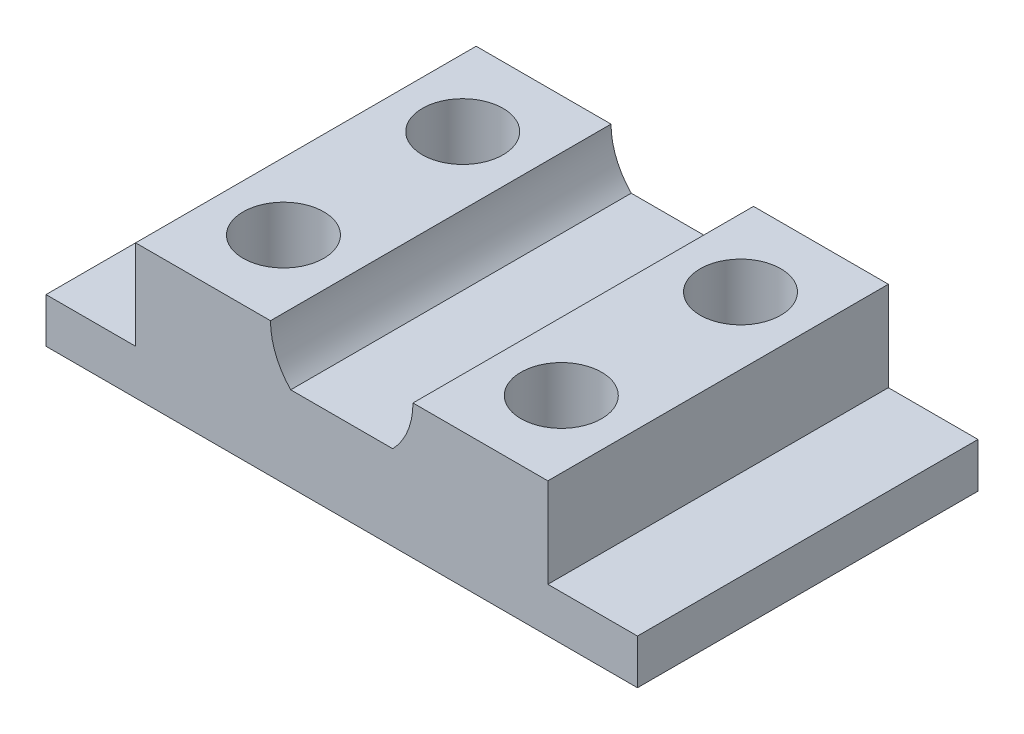
ISO-10303-21;
HEADER;
FILE_DESCRIPTION(('STEP AP214'),'2;1');
FILE_NAME('part.step','',(''),(''),'','','');
FILE_SCHEMA(('AUTOMOTIVE_DESIGN { 1 0 10303 214 1 1 1 1 }'));
ENDSEC;
DATA;
#1=APPLICATION_CONTEXT('core data for automotive mechanical design processes');
#2=APPLICATION_PROTOCOL_DEFINITION('international standard','automotive_design',2000,#1);
#3=PRODUCT_CONTEXT('',#1,'mechanical');
#4=PRODUCT('Part','Part','',(#3));
#5=PRODUCT_RELATED_PRODUCT_CATEGORY('part','',(#4));
#6=PRODUCT_DEFINITION_FORMATION('','',#4);
#7=PRODUCT_DEFINITION_CONTEXT('part definition',#1,'design');
#8=PRODUCT_DEFINITION('design','',#6,#7);
#9=PRODUCT_DEFINITION_SHAPE('','',#8);
#10=(LENGTH_UNIT() NAMED_UNIT(*) SI_UNIT(.MILLI.,.METRE.));
#11=(NAMED_UNIT(*) PLANE_ANGLE_UNIT() SI_UNIT($,.RADIAN.));
#12=(NAMED_UNIT(*) SI_UNIT($,.STERADIAN.) SOLID_ANGLE_UNIT());
#13=UNCERTAINTY_MEASURE_WITH_UNIT(LENGTH_MEASURE(1.E-05),#10,'distance_accuracy_value','');
#14=(GEOMETRIC_REPRESENTATION_CONTEXT(3) GLOBAL_UNCERTAINTY_ASSIGNED_CONTEXT((#13)) GLOBAL_UNIT_ASSIGNED_CONTEXT((#10,
#11,#12)) REPRESENTATION_CONTEXT('',''));
#15=CARTESIAN_POINT('',(0.,0.,0.));
#16=DIRECTION('',(0.,0.,1.));
#17=DIRECTION('',(1.,0.,0.));
#18=AXIS2_PLACEMENT_3D('',#15,#16,#17);
#19=CARTESIAN_POINT('',(23.,15.,-38.));
#20=DIRECTION('',(0.,0.,1.));
#21=DIRECTION('',(1.,0.,0.));
#22=AXIS2_PLACEMENT_3D('',#19,#20,#21);
#23=CYLINDRICAL_SURFACE('',#22,7.95);
#24=DIRECTION('',(0.,0.,1.));
#25=VECTOR('',#24,1.);
#26=CARTESIAN_POINT('',(28.6920997883031,9.45,-38.));
#27=LINE('',#26,#25);
#28=CARTESIAN_POINT('',(28.6920997883031,9.45,0.));
#29=VERTEX_POINT('',#28);
#30=CARTESIAN_POINT('',(28.6920997883031,9.45,-38.));
#31=VERTEX_POINT('',#30);
#32=EDGE_CURVE('E11',#29,#31,#27,.F.);
#33=ORIENTED_EDGE('',*,*,#32,.F.);
#34=CARTESIAN_POINT('',(23.,15.,0.));
#35=DIRECTION('',(0.,0.,1.));
#36=DIRECTION('',(1.,0.,0.));
#37=AXIS2_PLACEMENT_3D('',#34,#35,#36);
#38=CIRCLE('',#37,7.95);
#39=CARTESIAN_POINT('',(30.95,15.,0.));
#40=VERTEX_POINT('',#39);
#41=EDGE_CURVE('E128',#29,#40,#38,.T.);
#42=ORIENTED_EDGE('',*,*,#41,.T.);
#43=DIRECTION('',(0.,0.,1.));
#44=VECTOR('',#43,1.);
#45=CARTESIAN_POINT('',(30.95,15.,-38.));
#46=LINE('',#45,#44);
#47=CARTESIAN_POINT('',(30.95,15.,-38.));
#48=VERTEX_POINT('',#47);
#49=EDGE_CURVE('E137',#48,#40,#46,.T.);
#50=ORIENTED_EDGE('',*,*,#49,.F.);
#51=CARTESIAN_POINT('',(23.,15.,-38.));
#52=DIRECTION('',(0.,0.,1.));
#53=DIRECTION('',(1.,0.,0.));
#54=AXIS2_PLACEMENT_3D('',#51,#52,#53);
#55=CIRCLE('',#54,7.95);
#56=EDGE_CURVE('E53',#31,#48,#55,.T.);
#57=ORIENTED_EDGE('',*,*,#56,.F.);
#58=EDGE_LOOP('',(#33,#42,#50,#57));
#59=FACE_BOUND('',#58,.T.);
#60=ADVANCED_FACE('F35',(#59),#23,.F.);
#61=DIRECTION('',(0.,0.,1.));
#62=VECTOR('',#61,1.);
#63=CARTESIAN_POINT('',(17.3079002116969,9.45,-38.));
#64=LINE('',#63,#62);
#65=CARTESIAN_POINT('',(17.3079002116969,9.45,-38.));
#66=VERTEX_POINT('',#65);
#67=CARTESIAN_POINT('',(17.3079002116969,9.45,0.));
#68=VERTEX_POINT('',#67);
#69=EDGE_CURVE('E43',#66,#68,#64,.T.);
#70=ORIENTED_EDGE('',*,*,#69,.F.);
#71=CARTESIAN_POINT('',(15.05,15.,-38.));
#72=VERTEX_POINT('',#71);
#73=EDGE_CURVE('E181',#72,#66,#55,.T.);
#74=ORIENTED_EDGE('',*,*,#73,.F.);
#75=DIRECTION('',(0.,0.,1.));
#76=VECTOR('',#75,1.);
#77=CARTESIAN_POINT('',(15.05,15.,-38.));
#78=LINE('',#77,#76);
#79=CARTESIAN_POINT('',(15.05,15.,0.));
#80=VERTEX_POINT('',#79);
#81=EDGE_CURVE('E124',#80,#72,#78,.F.);
#82=ORIENTED_EDGE('',*,*,#81,.F.);
#83=EDGE_CURVE('E119',#80,#68,#38,.T.);
#84=ORIENTED_EDGE('',*,*,#83,.T.);
#85=EDGE_LOOP('',(#70,#74,#82,#84));
#86=FACE_BOUND('',#85,.T.);
#87=ADVANCED_FACE('F121',(#86),#23,.F.);
#88=CARTESIAN_POINT('',(0.,15.,0.));
#89=DIRECTION('',(1.,0.,0.));
#90=DIRECTION('',(0.,0.,-1.));
#91=AXIS2_PLACEMENT_3D('',#88,#89,#90);
#92=PLANE('',#91);
#93=DIRECTION('',(0.,0.,-1.));
#94=VECTOR('',#93,1.);
#95=CARTESIAN_POINT('',(0.,5.,-38.));
#96=LINE('',#95,#94);
#97=CARTESIAN_POINT('',(0.,5.,0.));
#98=VERTEX_POINT('',#97);
#99=CARTESIAN_POINT('',(0.,5.,-38.));
#100=VERTEX_POINT('',#99);
#101=EDGE_CURVE('E141',#98,#100,#96,.T.);
#102=ORIENTED_EDGE('',*,*,#101,.F.);
#103=DIRECTION('',(0.,-1.,0.));
#104=VECTOR('',#103,1.);
#105=CARTESIAN_POINT('',(0.,15.,0.));
#106=LINE('',#105,#104);
#107=CARTESIAN_POINT('',(0.,15.,0.));
#108=VERTEX_POINT('',#107);
#109=EDGE_CURVE('E230',#108,#98,#106,.T.);
#110=ORIENTED_EDGE('',*,*,#109,.F.);
#111=DIRECTION('',(0.,0.,1.));
#112=VECTOR('',#111,1.);
#113=CARTESIAN_POINT('',(0.,15.,0.));
#114=LINE('',#113,#112);
#115=CARTESIAN_POINT('',(0.,15.,-38.));
#116=VERTEX_POINT('',#115);
#117=EDGE_CURVE('E208',#116,#108,#114,.T.);
#118=ORIENTED_EDGE('',*,*,#117,.F.);
#119=DIRECTION('',(0.,-1.,0.));
#120=VECTOR('',#119,1.);
#121=CARTESIAN_POINT('',(0.,15.,-38.));
#122=LINE('',#121,#120);
#123=EDGE_CURVE('E221',#116,#100,#122,.T.);
#124=ORIENTED_EDGE('',*,*,#123,.T.);
#125=EDGE_LOOP('',(#102,#110,#118,#124));
#126=FACE_BOUND('',#125,.T.);
#127=ADVANCED_FACE('F37',(#126),#92,.F.);
#128=CARTESIAN_POINT('',(46.,15.,0.));
#129=DIRECTION('',(-1.,0.,0.));
#130=DIRECTION('',(0.,0.,1.));
#131=AXIS2_PLACEMENT_3D('',#128,#129,#130);
#132=PLANE('',#131);
#133=DIRECTION('',(0.,0.,1.));
#134=VECTOR('',#133,1.);
#135=CARTESIAN_POINT('',(46.,5.,0.));
#136=LINE('',#135,#134);
#137=CARTESIAN_POINT('',(46.,5.,-38.));
#138=VERTEX_POINT('',#137);
#139=CARTESIAN_POINT('',(46.,5.,0.));
#140=VERTEX_POINT('',#139);
#141=EDGE_CURVE('E162',#138,#140,#136,.T.);
#142=ORIENTED_EDGE('',*,*,#141,.F.);
#143=DIRECTION('',(0.,-1.,0.));
#144=VECTOR('',#143,1.);
#145=CARTESIAN_POINT('',(46.,15.,-38.));
#146=LINE('',#145,#144);
#147=CARTESIAN_POINT('',(46.,15.,-38.));
#148=VERTEX_POINT('',#147);
#149=EDGE_CURVE('E225',#148,#138,#146,.T.);
#150=ORIENTED_EDGE('',*,*,#149,.F.);
#151=DIRECTION('',(0.,0.,-1.));
#152=VECTOR('',#151,1.);
#153=CARTESIAN_POINT('',(46.,15.,0.));
#154=LINE('',#153,#152);
#155=CARTESIAN_POINT('',(46.,15.,0.));
#156=VERTEX_POINT('',#155);
#157=EDGE_CURVE('E215',#156,#148,#154,.T.);
#158=ORIENTED_EDGE('',*,*,#157,.F.);
#159=DIRECTION('',(0.,-1.,0.));
#160=VECTOR('',#159,1.);
#161=CARTESIAN_POINT('',(46.,15.,0.));
#162=LINE('',#161,#160);
#163=EDGE_CURVE('E228',#156,#140,#162,.T.);
#164=ORIENTED_EDGE('',*,*,#163,.T.);
#165=EDGE_LOOP('',(#142,#150,#158,#164));
#166=FACE_BOUND('',#165,.T.);
#167=ADVANCED_FACE('F244',(#166),#132,.F.);
#168=CARTESIAN_POINT('',(0.,15.,0.));
#169=DIRECTION('',(0.,-1.,0.));
#170=DIRECTION('',(0.,0.,-1.));
#171=AXIS2_PLACEMENT_3D('',#168,#169,#170);
#172=PLANE('',#171);
#173=CARTESIAN_POINT('',(38.5,15.,-9.));
#174=DIRECTION('',(0.,1.,0.));
#175=DIRECTION('',(0.,0.,1.));
#176=AXIS2_PLACEMENT_3D('',#173,#174,#175);
#177=CIRCLE('',#176,4.5);
#178=CARTESIAN_POINT('',(38.5,15.,-4.5));
#179=VERTEX_POINT('',#178);
#180=EDGE_CURVE('E195',#179,#179,#177,.T.);
#181=ORIENTED_EDGE('',*,*,#180,.F.);
#182=EDGE_LOOP('',(#181));
#183=FACE_BOUND('',#182,.T.);
#184=CARTESIAN_POINT('',(38.5,15.,-29.));
#185=DIRECTION('',(0.,1.,0.));
#186=DIRECTION('',(0.,0.,1.));
#187=AXIS2_PLACEMENT_3D('',#184,#185,#186);
#188=CIRCLE('',#187,4.5);
#189=CARTESIAN_POINT('',(38.5,15.,-24.5));
#190=VERTEX_POINT('',#189);
#191=EDGE_CURVE('E189',#190,#190,#188,.T.);
#192=ORIENTED_EDGE('',*,*,#191,.F.);
#193=EDGE_LOOP('',(#192));
#194=FACE_BOUND('',#193,.T.);
#195=DIRECTION('',(-1.,0.,0.));
#196=VECTOR('',#195,1.);
#197=CARTESIAN_POINT('',(0.,15.,-38.));
#198=LINE('',#197,#196);
#199=EDGE_CURVE('E218',#148,#48,#198,.T.);
#200=ORIENTED_EDGE('',*,*,#199,.T.);
#201=ORIENTED_EDGE('',*,*,#49,.T.);
#202=DIRECTION('',(1.,0.,0.));
#203=VECTOR('',#202,1.);
#204=CARTESIAN_POINT('',(0.,15.,0.));
#205=LINE('',#204,#203);
#206=EDGE_CURVE('E211',#40,#156,#205,.T.);
#207=ORIENTED_EDGE('',*,*,#206,.T.);
#208=ORIENTED_EDGE('',*,*,#157,.T.);
#209=EDGE_LOOP('',(#200,#201,#207,#208));
#210=FACE_BOUND('',#209,.T.);
#211=ADVANCED_FACE('F236',(#183,#194,#210),#172,.F.);
#212=CARTESIAN_POINT('',(0.,15.,0.));
#213=DIRECTION('',(0.,0.,-1.));
#214=DIRECTION('',(-1.,0.,0.));
#215=AXIS2_PLACEMENT_3D('',#212,#213,#214);
#216=PLANE('',#215);
#217=ORIENTED_EDGE('',*,*,#41,.F.);
#218=DIRECTION('',(1.,0.,0.));
#219=VECTOR('',#218,1.);
#220=CARTESIAN_POINT('',(14.1509468295142,9.45,0.));
#221=LINE('',#220,#219);
#222=EDGE_CURVE('E134',#68,#29,#221,.T.);
#223=ORIENTED_EDGE('',*,*,#222,.F.);
#224=ORIENTED_EDGE('',*,*,#83,.F.);
#225=EDGE_CURVE('E213',#108,#80,#205,.T.);
#226=ORIENTED_EDGE('',*,*,#225,.F.);
#227=ORIENTED_EDGE('',*,*,#109,.T.);
#228=DIRECTION('',(1.,0.,0.));
#229=VECTOR('',#228,1.);
#230=CARTESIAN_POINT('',(-10.,5.,0.));
#231=LINE('',#230,#229);
#232=CARTESIAN_POINT('',(-10.,5.,0.));
#233=VERTEX_POINT('',#232);
#234=EDGE_CURVE('E159',#233,#98,#231,.T.);
#235=ORIENTED_EDGE('',*,*,#234,.F.);
#236=DIRECTION('',(0.,1.,0.));
#237=VECTOR('',#236,1.);
#238=CARTESIAN_POINT('',(-10.,0.,0.));
#239=LINE('',#238,#237);
#240=CARTESIAN_POINT('',(-10.,0.,0.));
#241=VERTEX_POINT('',#240);
#242=EDGE_CURVE('E150',#241,#233,#239,.T.);
#243=ORIENTED_EDGE('',*,*,#242,.F.);
#244=DIRECTION('',(1.,0.,0.));
#245=VECTOR('',#244,1.);
#246=CARTESIAN_POINT('',(0.,0.,0.));
#247=LINE('',#246,#245);
#248=CARTESIAN_POINT('',(56.,0.,0.));
#249=VERTEX_POINT('',#248);
#250=EDGE_CURVE('E207',#241,#249,#247,.T.);
#251=ORIENTED_EDGE('',*,*,#250,.T.);
#252=DIRECTION('',(0.,-1.,0.));
#253=VECTOR('',#252,1.);
#254=CARTESIAN_POINT('',(56.,0.,0.));
#255=LINE('',#254,#253);
#256=CARTESIAN_POINT('',(56.,5.,0.));
#257=VERTEX_POINT('',#256);
#258=EDGE_CURVE('E163',#257,#249,#255,.T.);
#259=ORIENTED_EDGE('',*,*,#258,.F.);
#260=DIRECTION('',(-1.,0.,0.));
#261=VECTOR('',#260,1.);
#262=CARTESIAN_POINT('',(56.,5.,0.));
#263=LINE('',#262,#261);
#264=EDGE_CURVE('E173',#257,#140,#263,.T.);
#265=ORIENTED_EDGE('',*,*,#264,.T.);
#266=ORIENTED_EDGE('',*,*,#163,.F.);
#267=ORIENTED_EDGE('',*,*,#206,.F.);
#268=EDGE_LOOP('',(#217,#223,#224,#226,#227,#235,#243,#251,#259,#265,#266,#267));
#269=FACE_BOUND('',#268,.T.);
#270=ADVANCED_FACE('F138',(#269),#216,.F.);
#271=CARTESIAN_POINT('',(0.,15.,-38.));
#272=DIRECTION('',(0.,0.,1.));
#273=DIRECTION('',(1.,0.,0.));
#274=AXIS2_PLACEMENT_3D('',#271,#272,#273);
#275=PLANE('',#274);
#276=ORIENTED_EDGE('',*,*,#73,.T.);
#277=DIRECTION('',(-1.,0.,0.));
#278=VECTOR('',#277,1.);
#279=CARTESIAN_POINT('',(14.1509468295142,9.45,-38.));
#280=LINE('',#279,#278);
#281=EDGE_CURVE('E136',#31,#66,#280,.T.);
#282=ORIENTED_EDGE('',*,*,#281,.F.);
#283=ORIENTED_EDGE('',*,*,#56,.T.);
#284=ORIENTED_EDGE('',*,*,#199,.F.);
#285=ORIENTED_EDGE('',*,*,#149,.T.);
#286=DIRECTION('',(-1.,0.,0.));
#287=VECTOR('',#286,1.);
#288=CARTESIAN_POINT('',(56.,5.,-38.));
#289=LINE('',#288,#287);
#290=CARTESIAN_POINT('',(56.,5.,-38.));
#291=VERTEX_POINT('',#290);
#292=EDGE_CURVE('E178',#291,#138,#289,.T.);
#293=ORIENTED_EDGE('',*,*,#292,.F.);
#294=DIRECTION('',(0.,1.,0.));
#295=VECTOR('',#294,1.);
#296=CARTESIAN_POINT('',(56.,0.,-38.));
#297=LINE('',#296,#295);
#298=CARTESIAN_POINT('',(56.,0.,-38.));
#299=VERTEX_POINT('',#298);
#300=EDGE_CURVE('E169',#299,#291,#297,.T.);
#301=ORIENTED_EDGE('',*,*,#300,.F.);
#302=DIRECTION('',(-1.,0.,0.));
#303=VECTOR('',#302,1.);
#304=CARTESIAN_POINT('',(0.,0.,-38.));
#305=LINE('',#304,#303);
#306=CARTESIAN_POINT('',(-10.,0.,-38.));
#307=VERTEX_POINT('',#306);
#308=EDGE_CURVE('E212',#299,#307,#305,.T.);
#309=ORIENTED_EDGE('',*,*,#308,.T.);
#310=DIRECTION('',(0.,-1.,0.));
#311=VECTOR('',#310,1.);
#312=CARTESIAN_POINT('',(-10.,0.,-38.));
#313=LINE('',#312,#311);
#314=CARTESIAN_POINT('',(-10.,5.,-38.));
#315=VERTEX_POINT('',#314);
#316=EDGE_CURVE('E144',#315,#307,#313,.T.);
#317=ORIENTED_EDGE('',*,*,#316,.F.);
#318=DIRECTION('',(1.,0.,0.));
#319=VECTOR('',#318,1.);
#320=CARTESIAN_POINT('',(-10.,5.,-38.));
#321=LINE('',#320,#319);
#322=EDGE_CURVE('E154',#315,#100,#321,.T.);
#323=ORIENTED_EDGE('',*,*,#322,.T.);
#324=ORIENTED_EDGE('',*,*,#123,.F.);
#325=EDGE_CURVE('E217',#72,#116,#198,.T.);
#326=ORIENTED_EDGE('',*,*,#325,.F.);
#327=EDGE_LOOP('',(#276,#282,#283,#284,#285,#293,#301,#309,#317,#323,#324,#326));
#328=FACE_BOUND('',#327,.T.);
#329=ADVANCED_FACE('F247',(#328),#275,.F.);
#330=CARTESIAN_POINT('',(7.5,15.,-29.));
#331=DIRECTION('',(0.,1.,0.));
#332=DIRECTION('',(0.,0.,1.));
#333=AXIS2_PLACEMENT_3D('',#330,#331,#332);
#334=CIRCLE('',#333,4.5);
#335=CARTESIAN_POINT('',(7.5,15.,-24.5));
#336=VERTEX_POINT('',#335);
#337=EDGE_CURVE('E182',#336,#336,#334,.T.);
#338=ORIENTED_EDGE('',*,*,#337,.F.);
#339=EDGE_LOOP('',(#338));
#340=FACE_BOUND('',#339,.T.);
#341=CARTESIAN_POINT('',(7.5,15.,-9.));
#342=DIRECTION('',(0.,1.,0.));
#343=DIRECTION('',(0.,0.,1.));
#344=AXIS2_PLACEMENT_3D('',#341,#342,#343);
#345=CIRCLE('',#344,4.5);
#346=CARTESIAN_POINT('',(7.5,15.,-4.5));
#347=VERTEX_POINT('',#346);
#348=EDGE_CURVE('E201',#347,#347,#345,.T.);
#349=ORIENTED_EDGE('',*,*,#348,.F.);
#350=EDGE_LOOP('',(#349));
#351=FACE_BOUND('',#350,.T.);
#352=ORIENTED_EDGE('',*,*,#225,.T.);
#353=ORIENTED_EDGE('',*,*,#81,.T.);
#354=ORIENTED_EDGE('',*,*,#325,.T.);
#355=ORIENTED_EDGE('',*,*,#117,.T.);
#356=EDGE_LOOP('',(#352,#353,#354,#355));
#357=FACE_BOUND('',#356,.T.);
#358=ADVANCED_FACE('F251',(#340,#351,#357),#172,.F.);
#359=CARTESIAN_POINT('',(0.,0.,0.));
#360=DIRECTION('',(0.,-1.,0.));
#361=DIRECTION('',(0.,0.,-1.));
#362=AXIS2_PLACEMENT_3D('',#359,#360,#361);
#363=PLANE('',#362);
#364=CARTESIAN_POINT('',(7.5,0.,-29.));
#365=DIRECTION('',(0.,1.,0.));
#366=DIRECTION('',(0.,0.,1.));
#367=AXIS2_PLACEMENT_3D('',#364,#365,#366);
#368=CIRCLE('',#367,4.5);
#369=CARTESIAN_POINT('',(7.5,0.,-24.5));
#370=VERTEX_POINT('',#369);
#371=EDGE_CURVE('E186',#370,#370,#368,.T.);
#372=ORIENTED_EDGE('',*,*,#371,.T.);
#373=EDGE_LOOP('',(#372));
#374=FACE_BOUND('',#373,.T.);
#375=CARTESIAN_POINT('',(38.5,0.,-29.));
#376=DIRECTION('',(0.,1.,0.));
#377=DIRECTION('',(0.,0.,1.));
#378=AXIS2_PLACEMENT_3D('',#375,#376,#377);
#379=CIRCLE('',#378,4.5);
#380=CARTESIAN_POINT('',(38.5,0.,-24.5));
#381=VERTEX_POINT('',#380);
#382=EDGE_CURVE('E192',#381,#381,#379,.T.);
#383=ORIENTED_EDGE('',*,*,#382,.T.);
#384=EDGE_LOOP('',(#383));
#385=FACE_BOUND('',#384,.T.);
#386=CARTESIAN_POINT('',(38.5,0.,-9.));
#387=DIRECTION('',(0.,1.,0.));
#388=DIRECTION('',(0.,0.,1.));
#389=AXIS2_PLACEMENT_3D('',#386,#387,#388);
#390=CIRCLE('',#389,4.5);
#391=CARTESIAN_POINT('',(38.5,0.,-4.5));
#392=VERTEX_POINT('',#391);
#393=EDGE_CURVE('E198',#392,#392,#390,.T.);
#394=ORIENTED_EDGE('',*,*,#393,.T.);
#395=EDGE_LOOP('',(#394));
#396=FACE_BOUND('',#395,.T.);
#397=CARTESIAN_POINT('',(7.5,0.,-9.));
#398=DIRECTION('',(0.,1.,0.));
#399=DIRECTION('',(0.,0.,1.));
#400=AXIS2_PLACEMENT_3D('',#397,#398,#399);
#401=CIRCLE('',#400,4.5);
#402=CARTESIAN_POINT('',(7.5,0.,-4.5));
#403=VERTEX_POINT('',#402);
#404=EDGE_CURVE('E204',#403,#403,#401,.T.);
#405=ORIENTED_EDGE('',*,*,#404,.T.);
#406=EDGE_LOOP('',(#405));
#407=FACE_BOUND('',#406,.T.);
#408=ORIENTED_EDGE('',*,*,#250,.F.);
#409=DIRECTION('',(0.,0.,1.));
#410=VECTOR('',#409,1.);
#411=CARTESIAN_POINT('',(-10.,0.,-38.));
#412=LINE('',#411,#410);
#413=EDGE_CURVE('E147',#307,#241,#412,.T.);
#414=ORIENTED_EDGE('',*,*,#413,.F.);
#415=ORIENTED_EDGE('',*,*,#308,.F.);
#416=DIRECTION('',(0.,0.,-1.));
#417=VECTOR('',#416,1.);
#418=CARTESIAN_POINT('',(56.,0.,0.));
#419=LINE('',#418,#417);
#420=EDGE_CURVE('E166',#249,#299,#419,.T.);
#421=ORIENTED_EDGE('',*,*,#420,.F.);
#422=EDGE_LOOP('',(#408,#414,#415,#421));
#423=FACE_BOUND('',#422,.T.);
#424=ADVANCED_FACE('F267',(#374,#385,#396,#407,#423),#363,.T.);
#425=CARTESIAN_POINT('',(7.5,15.,-9.));
#426=DIRECTION('',(0.,1.,0.));
#427=DIRECTION('',(0.,0.,1.));
#428=AXIS2_PLACEMENT_3D('',#425,#426,#427);
#429=CYLINDRICAL_SURFACE('',#428,4.5);
#430=ORIENTED_EDGE('',*,*,#404,.F.);
#431=EDGE_LOOP('',(#430));
#432=FACE_BOUND('',#431,.T.);
#433=ORIENTED_EDGE('',*,*,#348,.T.);
#434=EDGE_LOOP('',(#433));
#435=FACE_BOUND('',#434,.T.);
#436=ADVANCED_FACE('F298',(#432,#435),#429,.F.);
#437=CARTESIAN_POINT('',(38.5,15.,-9.));
#438=DIRECTION('',(0.,1.,0.));
#439=DIRECTION('',(0.,0.,1.));
#440=AXIS2_PLACEMENT_3D('',#437,#438,#439);
#441=CYLINDRICAL_SURFACE('',#440,4.5);
#442=ORIENTED_EDGE('',*,*,#393,.F.);
#443=EDGE_LOOP('',(#442));
#444=FACE_BOUND('',#443,.T.);
#445=ORIENTED_EDGE('',*,*,#180,.T.);
#446=EDGE_LOOP('',(#445));
#447=FACE_BOUND('',#446,.T.);
#448=ADVANCED_FACE('F294',(#444,#447),#441,.F.);
#449=CARTESIAN_POINT('',(38.5,15.,-29.));
#450=DIRECTION('',(0.,1.,0.));
#451=DIRECTION('',(0.,0.,1.));
#452=AXIS2_PLACEMENT_3D('',#449,#450,#451);
#453=CYLINDRICAL_SURFACE('',#452,4.5);
#454=ORIENTED_EDGE('',*,*,#382,.F.);
#455=EDGE_LOOP('',(#454));
#456=FACE_BOUND('',#455,.T.);
#457=ORIENTED_EDGE('',*,*,#191,.T.);
#458=EDGE_LOOP('',(#457));
#459=FACE_BOUND('',#458,.T.);
#460=ADVANCED_FACE('F290',(#456,#459),#453,.F.);
#461=CARTESIAN_POINT('',(7.5,15.,-29.));
#462=DIRECTION('',(0.,1.,0.));
#463=DIRECTION('',(0.,0.,1.));
#464=AXIS2_PLACEMENT_3D('',#461,#462,#463);
#465=CYLINDRICAL_SURFACE('',#464,4.5);
#466=ORIENTED_EDGE('',*,*,#371,.F.);
#467=EDGE_LOOP('',(#466));
#468=FACE_BOUND('',#467,.T.);
#469=ORIENTED_EDGE('',*,*,#337,.T.);
#470=EDGE_LOOP('',(#469));
#471=FACE_BOUND('',#470,.T.);
#472=ADVANCED_FACE('F287',(#468,#471),#465,.F.);
#473=CARTESIAN_POINT('',(56.,5.,0.));
#474=DIRECTION('',(0.,-1.,0.));
#475=DIRECTION('',(0.,0.,-1.));
#476=AXIS2_PLACEMENT_3D('',#473,#474,#475);
#477=PLANE('',#476);
#478=ORIENTED_EDGE('',*,*,#141,.T.);
#479=ORIENTED_EDGE('',*,*,#264,.F.);
#480=DIRECTION('',(0.,0.,1.));
#481=VECTOR('',#480,1.);
#482=CARTESIAN_POINT('',(56.,5.,0.));
#483=LINE('',#482,#481);
#484=EDGE_CURVE('E171',#291,#257,#483,.T.);
#485=ORIENTED_EDGE('',*,*,#484,.F.);
#486=ORIENTED_EDGE('',*,*,#292,.T.);
#487=EDGE_LOOP('',(#478,#479,#485,#486));
#488=FACE_BOUND('',#487,.T.);
#489=ADVANCED_FACE('F273',(#488),#477,.F.);
#490=CARTESIAN_POINT('',(56.,0.,0.));
#491=DIRECTION('',(-1.,0.,0.));
#492=DIRECTION('',(0.,0.,1.));
#493=AXIS2_PLACEMENT_3D('',#490,#491,#492);
#494=PLANE('',#493);
#495=ORIENTED_EDGE('',*,*,#258,.T.);
#496=ORIENTED_EDGE('',*,*,#420,.T.);
#497=ORIENTED_EDGE('',*,*,#300,.T.);
#498=ORIENTED_EDGE('',*,*,#484,.T.);
#499=EDGE_LOOP('',(#495,#496,#497,#498));
#500=FACE_BOUND('',#499,.T.);
#501=ADVANCED_FACE('F270',(#500),#494,.F.);
#502=CARTESIAN_POINT('',(-10.,5.,-38.));
#503=DIRECTION('',(0.,-1.,0.));
#504=DIRECTION('',(0.,0.,-1.));
#505=AXIS2_PLACEMENT_3D('',#502,#503,#504);
#506=PLANE('',#505);
#507=ORIENTED_EDGE('',*,*,#101,.T.);
#508=ORIENTED_EDGE('',*,*,#322,.F.);
#509=DIRECTION('',(0.,0.,-1.));
#510=VECTOR('',#509,1.);
#511=CARTESIAN_POINT('',(-10.,5.,-38.));
#512=LINE('',#511,#510);
#513=EDGE_CURVE('E152',#233,#315,#512,.T.);
#514=ORIENTED_EDGE('',*,*,#513,.F.);
#515=ORIENTED_EDGE('',*,*,#234,.T.);
#516=EDGE_LOOP('',(#507,#508,#514,#515));
#517=FACE_BOUND('',#516,.T.);
#518=ADVANCED_FACE('F259',(#517),#506,.F.);
#519=CARTESIAN_POINT('',(-10.,0.,0.));
#520=DIRECTION('',(1.,0.,0.));
#521=DIRECTION('',(0.,0.,-1.));
#522=AXIS2_PLACEMENT_3D('',#519,#520,#521);
#523=PLANE('',#522);
#524=ORIENTED_EDGE('',*,*,#316,.T.);
#525=ORIENTED_EDGE('',*,*,#413,.T.);
#526=ORIENTED_EDGE('',*,*,#242,.T.);
#527=ORIENTED_EDGE('',*,*,#513,.T.);
#528=EDGE_LOOP('',(#524,#525,#526,#527));
#529=FACE_BOUND('',#528,.T.);
#530=ADVANCED_FACE('F263',(#529),#523,.F.);
#531=CARTESIAN_POINT('',(0.,9.45,0.));
#532=DIRECTION('',(0.,-1.,0.));
#533=DIRECTION('',(0.,0.,-1.));
#534=AXIS2_PLACEMENT_3D('',#531,#532,#533);
#535=PLANE('',#534);
#536=ORIENTED_EDGE('',*,*,#222,.T.);
#537=ORIENTED_EDGE('',*,*,#32,.T.);
#538=ORIENTED_EDGE('',*,*,#281,.T.);
#539=ORIENTED_EDGE('',*,*,#69,.T.);
#540=EDGE_LOOP('',(#536,#537,#538,#539));
#541=FACE_BOUND('',#540,.T.);
#542=ADVANCED_FACE('F133',(#541),#535,.F.);
#543=CLOSED_SHELL('',(#60,#87,#127,#167,#211,#270,#329,#358,#424,#436,#448,#460,#472,#489,#501,
#518,#530,#542));
#544=MANIFOLD_SOLID_BREP('B2',#543);
#545=ADVANCED_BREP_SHAPE_REPRESENTATION('',(#18,#544),#14);
#546=SHAPE_DEFINITION_REPRESENTATION(#9,#545);
ENDSEC;
END-ISO-10303-21;
